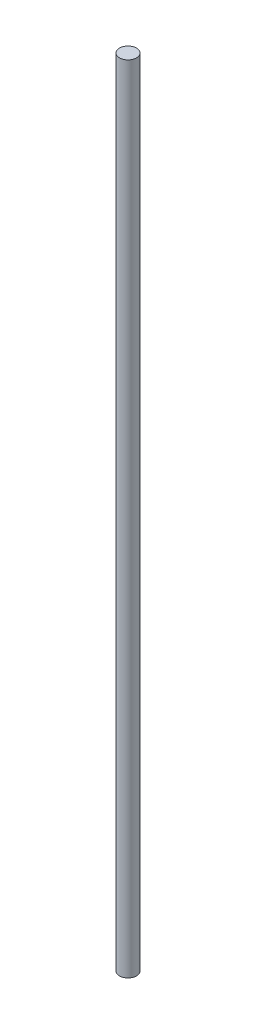
ISO-10303-21;
HEADER;
FILE_DESCRIPTION(('STEP AP214'),'2;1');
FILE_NAME('part.step','',(''),(''),'','','');
FILE_SCHEMA(('AUTOMOTIVE_DESIGN { 1 0 10303 214 1 1 1 1 }'));
ENDSEC;
DATA;
#1=APPLICATION_CONTEXT('core data for automotive mechanical design processes');
#2=APPLICATION_PROTOCOL_DEFINITION('international standard','automotive_design',2000,#1);
#3=PRODUCT_CONTEXT('',#1,'mechanical');
#4=PRODUCT('Part','Part','',(#3));
#5=PRODUCT_RELATED_PRODUCT_CATEGORY('part','',(#4));
#6=PRODUCT_DEFINITION_FORMATION('','',#4);
#7=PRODUCT_DEFINITION_CONTEXT('part definition',#1,'design');
#8=PRODUCT_DEFINITION('design','',#6,#7);
#9=PRODUCT_DEFINITION_SHAPE('','',#8);
#10=(LENGTH_UNIT() NAMED_UNIT(*) SI_UNIT(.MILLI.,.METRE.));
#11=(NAMED_UNIT(*) PLANE_ANGLE_UNIT() SI_UNIT($,.RADIAN.));
#12=(NAMED_UNIT(*) SI_UNIT($,.STERADIAN.) SOLID_ANGLE_UNIT());
#13=UNCERTAINTY_MEASURE_WITH_UNIT(LENGTH_MEASURE(1.E-05),#10,'distance_accuracy_value','');
#14=(GEOMETRIC_REPRESENTATION_CONTEXT(3) GLOBAL_UNCERTAINTY_ASSIGNED_CONTEXT((#13)) GLOBAL_UNIT_ASSIGNED_CONTEXT((#10,
#11,#12)) REPRESENTATION_CONTEXT('',''));
#15=CARTESIAN_POINT('',(0.,0.,0.));
#16=DIRECTION('',(0.,0.,1.));
#17=DIRECTION('',(1.,0.,0.));
#18=AXIS2_PLACEMENT_3D('',#15,#16,#17);
#19=CARTESIAN_POINT('',(0.,140.,0.));
#20=DIRECTION('',(0.,-1.,0.));
#21=DIRECTION('',(0.,0.,-1.));
#22=AXIS2_PLACEMENT_3D('',#19,#20,#21);
#23=CYLINDRICAL_SURFACE('',#22,1.5);
#24=CARTESIAN_POINT('',(0.,140.,0.));
#25=DIRECTION('',(0.,-1.,0.));
#26=DIRECTION('',(0.,0.,-1.));
#27=AXIS2_PLACEMENT_3D('',#24,#25,#26);
#28=CIRCLE('',#27,1.5);
#29=CARTESIAN_POINT('',(0.,140.,-1.5));
#30=VERTEX_POINT('',#29);
#31=EDGE_CURVE('E10',#30,#30,#28,.T.);
#32=ORIENTED_EDGE('',*,*,#31,.T.);
#33=EDGE_LOOP('',(#32));
#34=FACE_BOUND('',#33,.T.);
#35=CARTESIAN_POINT('',(0.,0.,0.));
#36=DIRECTION('',(0.,-1.,0.));
#37=DIRECTION('',(0.,0.,-1.));
#38=AXIS2_PLACEMENT_3D('',#35,#36,#37);
#39=CIRCLE('',#38,1.5);
#40=CARTESIAN_POINT('',(0.,0.,-1.5));
#41=VERTEX_POINT('',#40);
#42=EDGE_CURVE('E41',#41,#41,#39,.T.);
#43=ORIENTED_EDGE('',*,*,#42,.F.);
#44=EDGE_LOOP('',(#43));
#45=FACE_BOUND('',#44,.T.);
#46=ADVANCED_FACE('F35',(#34,#45),#23,.T.);
#47=CARTESIAN_POINT('',(1.5,140.,0.));
#48=DIRECTION('',(0.,1.,0.));
#49=DIRECTION('',(0.,0.,1.));
#50=AXIS2_PLACEMENT_3D('',#47,#48,#49);
#51=PLANE('',#50);
#52=ORIENTED_EDGE('',*,*,#31,.F.);
#53=EDGE_LOOP('',(#52));
#54=FACE_BOUND('',#53,.T.);
#55=ADVANCED_FACE('F50',(#54),#51,.T.);
#56=CARTESIAN_POINT('',(0.,0.,0.));
#57=DIRECTION('',(0.,-1.,0.));
#58=DIRECTION('',(0.,0.,-1.));
#59=AXIS2_PLACEMENT_3D('',#56,#57,#58);
#60=PLANE('',#59);
#61=ORIENTED_EDGE('',*,*,#42,.T.);
#62=EDGE_LOOP('',(#61));
#63=FACE_BOUND('',#62,.T.);
#64=ADVANCED_FACE('F47',(#63),#60,.T.);
#65=CLOSED_SHELL('',(#46,#55,#64));
#66=MANIFOLD_SOLID_BREP('B2',#65);
#67=ADVANCED_BREP_SHAPE_REPRESENTATION('',(#18,#66),#14);
#68=SHAPE_DEFINITION_REPRESENTATION(#9,#67);
ENDSEC;
END-ISO-10303-21;
